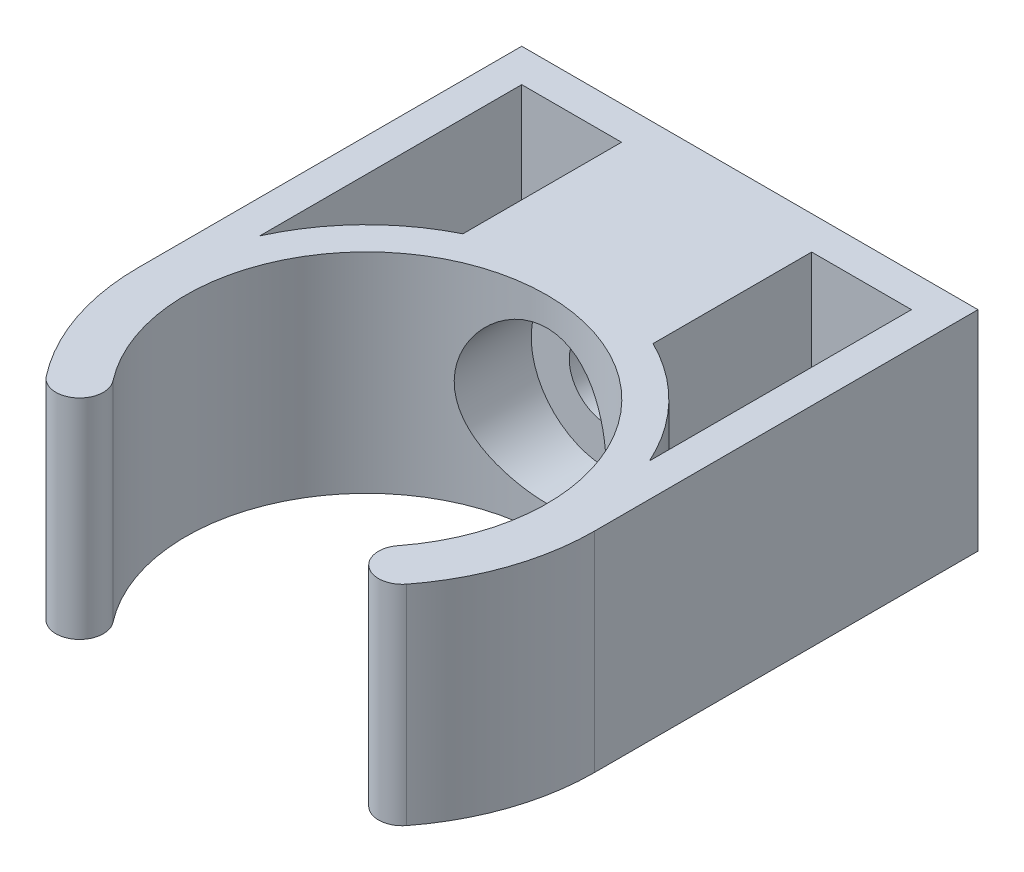
ISO-10303-21;
HEADER;
FILE_DESCRIPTION(('STEP AP214'),'2;1');
FILE_NAME('part.step','',(''),(''),'','','');
FILE_SCHEMA(('AUTOMOTIVE_DESIGN { 1 0 10303 214 1 1 1 1 }'));
ENDSEC;
DATA;
#1=APPLICATION_CONTEXT('core data for automotive mechanical design processes');
#2=APPLICATION_PROTOCOL_DEFINITION('international standard','automotive_design',2000,#1);
#3=PRODUCT_CONTEXT('',#1,'mechanical');
#4=PRODUCT('Part','Part','',(#3));
#5=PRODUCT_RELATED_PRODUCT_CATEGORY('part','',(#4));
#6=PRODUCT_DEFINITION_FORMATION('','',#4);
#7=PRODUCT_DEFINITION_CONTEXT('part definition',#1,'design');
#8=PRODUCT_DEFINITION('design','',#6,#7);
#9=PRODUCT_DEFINITION_SHAPE('','',#8);
#10=(LENGTH_UNIT() NAMED_UNIT(*) SI_UNIT(.MILLI.,.METRE.));
#11=(NAMED_UNIT(*) PLANE_ANGLE_UNIT() SI_UNIT($,.RADIAN.));
#12=(NAMED_UNIT(*) SI_UNIT($,.STERADIAN.) SOLID_ANGLE_UNIT());
#13=UNCERTAINTY_MEASURE_WITH_UNIT(LENGTH_MEASURE(1.E-05),#10,'distance_accuracy_value','');
#14=(GEOMETRIC_REPRESENTATION_CONTEXT(3) GLOBAL_UNCERTAINTY_ASSIGNED_CONTEXT((#13)) GLOBAL_UNIT_ASSIGNED_CONTEXT((#10,
#11,#12)) REPRESENTATION_CONTEXT('',''));
#15=CARTESIAN_POINT('',(0.,0.,0.));
#16=DIRECTION('',(0.,0.,1.));
#17=DIRECTION('',(1.,0.,0.));
#18=AXIS2_PLACEMENT_3D('',#15,#16,#17);
#19=CARTESIAN_POINT('',(-12.,11.,-11.25));
#20=DIRECTION('',(0.,0.,1.));
#21=DIRECTION('',(1.,0.,0.));
#22=AXIS2_PLACEMENT_3D('',#19,#20,#21);
#23=PLANE('',#22);
#24=DIRECTION('',(-1.,0.,0.));
#25=VECTOR('',#24,1.);
#26=CARTESIAN_POINT('',(-12.,1.75,-11.25));
#27=LINE('',#26,#25);
#28=CARTESIAN_POINT('',(-5.,1.75,-11.25));
#29=VERTEX_POINT('',#28);
#30=CARTESIAN_POINT('',(-10.25,1.75,-11.25));
#31=VERTEX_POINT('',#30);
#32=EDGE_CURVE('E317',#29,#31,#27,.T.);
#33=ORIENTED_EDGE('',*,*,#32,.F.);
#34=DIRECTION('',(0.,1.,0.));
#35=VECTOR('',#34,1.);
#36=CARTESIAN_POINT('',(-5.,11.,-11.25));
#37=LINE('',#36,#35);
#38=CARTESIAN_POINT('',(-5.,11.,-11.25));
#39=VERTEX_POINT('',#38);
#40=EDGE_CURVE('E95',#29,#39,#37,.T.);
#41=ORIENTED_EDGE('',*,*,#40,.T.);
#42=DIRECTION('',(-1.,0.,0.));
#43=VECTOR('',#42,1.);
#44=CARTESIAN_POINT('',(-12.,11.,-11.25));
#45=LINE('',#44,#43);
#46=CARTESIAN_POINT('',(-10.25,11.,-11.25));
#47=VERTEX_POINT('',#46);
#48=EDGE_CURVE('E102',#39,#47,#45,.T.);
#49=ORIENTED_EDGE('',*,*,#48,.T.);
#50=DIRECTION('',(0.,-1.,0.));
#51=VECTOR('',#50,1.);
#52=CARTESIAN_POINT('',(-10.25,11.,-11.25));
#53=LINE('',#52,#51);
#54=EDGE_CURVE('E213',#47,#31,#53,.T.);
#55=ORIENTED_EDGE('',*,*,#54,.T.);
#56=EDGE_LOOP('',(#33,#41,#49,#55));
#57=FACE_BOUND('',#56,.T.);
#58=ADVANCED_FACE('F73',(#57),#23,.T.);
#59=CARTESIAN_POINT('',(0.,11.,7.1690481051547));
#60=DIRECTION('',(0.,-1.,0.));
#61=DIRECTION('',(0.,0.,-1.));
#62=AXIS2_PLACEMENT_3D('',#59,#60,#61);
#63=CYLINDRICAL_SURFACE('',#62,11.25);
#64=CARTESIAN_POINT('',(0.,11.,7.1690481051547));
#65=DIRECTION('',(0.,1.,0.));
#66=DIRECTION('',(0.,0.,1.));
#67=AXIS2_PLACEMENT_3D('',#64,#65,#66);
#68=CIRCLE('',#67,11.25);
#69=CARTESIAN_POINT('',(-10.25,11.,2.53223885740684));
#70=VERTEX_POINT('',#69);
#71=CARTESIAN_POINT('',(-5.,11.,-2.90877408021849));
#72=VERTEX_POINT('',#71);
#73=EDGE_CURVE('E205',#70,#72,#68,.F.);
#74=ORIENTED_EDGE('',*,*,#73,.T.);
#75=DIRECTION('',(0.,-1.,0.));
#76=VECTOR('',#75,1.);
#77=CARTESIAN_POINT('',(-5.,11.,-2.90877408021849));
#78=LINE('',#77,#76);
#79=CARTESIAN_POINT('',(-5.,1.75,-2.90877408021849));
#80=VERTEX_POINT('',#79);
#81=EDGE_CURVE('E191',#72,#80,#78,.T.);
#82=ORIENTED_EDGE('',*,*,#81,.T.);
#83=CARTESIAN_POINT('',(0.,1.75,7.1690481051547));
#84=DIRECTION('',(0.,1.,0.));
#85=DIRECTION('',(0.,0.,1.));
#86=AXIS2_PLACEMENT_3D('',#83,#84,#85);
#87=CIRCLE('',#86,11.25);
#88=CARTESIAN_POINT('',(-10.25,1.75,2.53223885740684));
#89=VERTEX_POINT('',#88);
#90=EDGE_CURVE('E319',#89,#80,#87,.F.);
#91=ORIENTED_EDGE('',*,*,#90,.F.);
#92=DIRECTION('',(0.,-1.,0.));
#93=VECTOR('',#92,1.);
#94=CARTESIAN_POINT('',(-10.25,11.,2.53223885740684));
#95=LINE('',#94,#93);
#96=EDGE_CURVE('E210',#70,#89,#95,.T.);
#97=ORIENTED_EDGE('',*,*,#96,.F.);
#98=EDGE_LOOP('',(#74,#82,#91,#97));
#99=FACE_BOUND('',#98,.T.);
#100=ADVANCED_FACE('F209',(#99),#63,.T.);
#101=CARTESIAN_POINT('',(0.,1.75,7.1690481051547));
#102=DIRECTION('',(0.,1.,0.));
#103=DIRECTION('',(0.,0.,1.));
#104=AXIS2_PLACEMENT_3D('',#101,#102,#103);
#105=PLANE('',#104);
#106=ORIENTED_EDGE('',*,*,#90,.T.);
#107=DIRECTION('',(0.,0.,-1.));
#108=VECTOR('',#107,1.);
#109=CARTESIAN_POINT('',(-5.,1.75,7.1690481051547));
#110=LINE('',#109,#108);
#111=EDGE_CURVE('E88',#80,#29,#110,.T.);
#112=ORIENTED_EDGE('',*,*,#111,.T.);
#113=ORIENTED_EDGE('',*,*,#32,.T.);
#114=DIRECTION('',(0.,0.,1.));
#115=VECTOR('',#114,1.);
#116=CARTESIAN_POINT('',(-10.25,1.75,7.1690481051547));
#117=LINE('',#116,#115);
#118=EDGE_CURVE('E327',#31,#89,#117,.T.);
#119=ORIENTED_EDGE('',*,*,#118,.T.);
#120=EDGE_LOOP('',(#106,#112,#113,#119));
#121=FACE_BOUND('',#120,.T.);
#122=ADVANCED_FACE('F315',(#121),#105,.T.);
#123=CARTESIAN_POINT('',(12.,11.,7.1690481051547));
#124=DIRECTION('',(-1.,0.,0.));
#125=DIRECTION('',(0.,0.,1.));
#126=AXIS2_PLACEMENT_3D('',#123,#124,#125);
#127=PLANE('',#126);
#128=DIRECTION('',(0.,0.,-1.));
#129=VECTOR('',#128,1.);
#130=CARTESIAN_POINT('',(12.,0.,7.1690481051547));
#131=LINE('',#130,#129);
#132=CARTESIAN_POINT('',(12.,0.,7.1690481051547));
#133=VERTEX_POINT('',#132);
#134=CARTESIAN_POINT('',(12.,0.,-13.));
#135=VERTEX_POINT('',#134);
#136=EDGE_CURVE('E230',#133,#135,#131,.T.);
#137=ORIENTED_EDGE('',*,*,#136,.T.);
#138=DIRECTION('',(0.,-1.,0.));
#139=VECTOR('',#138,1.);
#140=CARTESIAN_POINT('',(12.,11.,-13.));
#141=LINE('',#140,#139);
#142=CARTESIAN_POINT('',(12.,11.,-13.));
#143=VERTEX_POINT('',#142);
#144=EDGE_CURVE('E308',#143,#135,#141,.T.);
#145=ORIENTED_EDGE('',*,*,#144,.F.);
#146=DIRECTION('',(0.,0.,-1.));
#147=VECTOR('',#146,1.);
#148=CARTESIAN_POINT('',(12.,11.,7.1690481051547));
#149=LINE('',#148,#147);
#150=CARTESIAN_POINT('',(12.,11.,7.1690481051547));
#151=VERTEX_POINT('',#150);
#152=EDGE_CURVE('E231',#151,#143,#149,.T.);
#153=ORIENTED_EDGE('',*,*,#152,.F.);
#154=DIRECTION('',(0.,-1.,0.));
#155=VECTOR('',#154,1.);
#156=CARTESIAN_POINT('',(12.,11.,7.1690481051547));
#157=LINE('',#156,#155);
#158=EDGE_CURVE('E257',#151,#133,#157,.T.);
#159=ORIENTED_EDGE('',*,*,#158,.T.);
#160=EDGE_LOOP('',(#137,#145,#153,#159));
#161=FACE_BOUND('',#160,.T.);
#162=ADVANCED_FACE('F75',(#161),#127,.F.);
#163=CARTESIAN_POINT('',(-12.,11.,-13.));
#164=DIRECTION('',(0.,0.,1.));
#165=DIRECTION('',(1.,0.,0.));
#166=AXIS2_PLACEMENT_3D('',#163,#164,#165);
#167=PLANE('',#166);
#168=CARTESIAN_POINT('',(0.,5.49999999999999,-13.));
#169=DIRECTION('',(0.,0.,1.));
#170=DIRECTION('',(1.,0.,0.));
#171=AXIS2_PLACEMENT_3D('',#168,#169,#170);
#172=CIRCLE('',#171,2.);
#173=CARTESIAN_POINT('',(2.,5.49999999999999,-13.));
#174=VERTEX_POINT('',#173);
#175=EDGE_CURVE('E374',#174,#174,#172,.T.);
#176=ORIENTED_EDGE('',*,*,#175,.T.);
#177=EDGE_LOOP('',(#176));
#178=FACE_BOUND('',#177,.T.);
#179=DIRECTION('',(0.,-1.,0.));
#180=VECTOR('',#179,1.);
#181=CARTESIAN_POINT('',(-12.,11.,-13.));
#182=LINE('',#181,#180);
#183=CARTESIAN_POINT('',(-12.,11.,-13.));
#184=VERTEX_POINT('',#183);
#185=CARTESIAN_POINT('',(-12.,0.,-13.));
#186=VERTEX_POINT('',#185);
#187=EDGE_CURVE('E304',#184,#186,#182,.T.);
#188=ORIENTED_EDGE('',*,*,#187,.F.);
#189=DIRECTION('',(-1.,0.,0.));
#190=VECTOR('',#189,1.);
#191=CARTESIAN_POINT('',(-12.,11.,-13.));
#192=LINE('',#191,#190);
#193=EDGE_CURVE('E235',#143,#184,#192,.T.);
#194=ORIENTED_EDGE('',*,*,#193,.F.);
#195=ORIENTED_EDGE('',*,*,#144,.T.);
#196=DIRECTION('',(-1.,0.,0.));
#197=VECTOR('',#196,1.);
#198=CARTESIAN_POINT('',(-12.,0.,-13.));
#199=LINE('',#198,#197);
#200=EDGE_CURVE('E261',#135,#186,#199,.T.);
#201=ORIENTED_EDGE('',*,*,#200,.T.);
#202=EDGE_LOOP('',(#188,#194,#195,#201));
#203=FACE_BOUND('',#202,.T.);
#204=ADVANCED_FACE('F444',(#178,#203),#167,.F.);
#205=CARTESIAN_POINT('',(-12.,11.,7.1690481051547));
#206=DIRECTION('',(1.,0.,0.));
#207=DIRECTION('',(0.,0.,-1.));
#208=AXIS2_PLACEMENT_3D('',#205,#206,#207);
#209=PLANE('',#208);
#210=DIRECTION('',(0.,0.,1.));
#211=VECTOR('',#210,1.);
#212=CARTESIAN_POINT('',(-12.,0.,7.1690481051547));
#213=LINE('',#212,#211);
#214=CARTESIAN_POINT('',(-12.,0.,7.1690481051547));
#215=VERTEX_POINT('',#214);
#216=EDGE_CURVE('E264',#186,#215,#213,.T.);
#217=ORIENTED_EDGE('',*,*,#216,.T.);
#218=DIRECTION('',(0.,-1.,0.));
#219=VECTOR('',#218,1.);
#220=CARTESIAN_POINT('',(-12.,11.,7.1690481051547));
#221=LINE('',#220,#219);
#222=CARTESIAN_POINT('',(-12.,11.,7.1690481051547));
#223=VERTEX_POINT('',#222);
#224=EDGE_CURVE('E300',#223,#215,#221,.T.);
#225=ORIENTED_EDGE('',*,*,#224,.F.);
#226=DIRECTION('',(0.,0.,1.));
#227=VECTOR('',#226,1.);
#228=CARTESIAN_POINT('',(-12.,11.,7.1690481051547));
#229=LINE('',#228,#227);
#230=EDGE_CURVE('E239',#184,#223,#229,.T.);
#231=ORIENTED_EDGE('',*,*,#230,.F.);
#232=ORIENTED_EDGE('',*,*,#187,.T.);
#233=EDGE_LOOP('',(#217,#225,#231,#232));
#234=FACE_BOUND('',#233,.T.);
#235=ADVANCED_FACE('F441',(#234),#209,.F.);
#236=CARTESIAN_POINT('',(0.,11.,7.1690481051547));
#237=DIRECTION('',(0.,-1.,0.));
#238=DIRECTION('',(0.,0.,-1.));
#239=AXIS2_PLACEMENT_3D('',#236,#237,#238);
#240=CYLINDRICAL_SURFACE('',#239,12.);
#241=CARTESIAN_POINT('',(0.,0.,7.1690481051547));
#242=DIRECTION('',(0.,1.,0.));
#243=DIRECTION('',(0.,0.,1.));
#244=AXIS2_PLACEMENT_3D('',#241,#242,#243);
#245=CIRCLE('',#244,12.);
#246=CARTESIAN_POINT('',(-9.47368421052632,0.,14.5344610249593));
#247=VERTEX_POINT('',#246);
#248=EDGE_CURVE('E267',#215,#247,#245,.T.);
#249=ORIENTED_EDGE('',*,*,#248,.T.);
#250=DIRECTION('',(0.,-1.,0.));
#251=VECTOR('',#250,1.);
#252=CARTESIAN_POINT('',(-9.47368421052632,11.,14.5344610249593));
#253=LINE('',#252,#251);
#254=CARTESIAN_POINT('',(-9.47368421052632,11.,14.5344610249593));
#255=VERTEX_POINT('',#254);
#256=EDGE_CURVE('E296',#255,#247,#253,.T.);
#257=ORIENTED_EDGE('',*,*,#256,.F.);
#258=CARTESIAN_POINT('',(0.,11.,7.1690481051547));
#259=DIRECTION('',(0.,1.,0.));
#260=DIRECTION('',(0.,0.,1.));
#261=AXIS2_PLACEMENT_3D('',#258,#259,#260);
#262=CIRCLE('',#261,12.);
#263=EDGE_CURVE('E242',#223,#255,#262,.T.);
#264=ORIENTED_EDGE('',*,*,#263,.F.);
#265=ORIENTED_EDGE('',*,*,#224,.T.);
#266=EDGE_LOOP('',(#249,#257,#264,#265));
#267=FACE_BOUND('',#266,.T.);
#268=ADVANCED_FACE('F437',(#267),#240,.T.);
#269=CARTESIAN_POINT('',(-8.48684210526316,11.,13.7672305124796));
#270=DIRECTION('',(0.,-1.,0.));
#271=DIRECTION('',(0.,0.,-1.));
#272=AXIS2_PLACEMENT_3D('',#269,#270,#271);
#273=CYLINDRICAL_SURFACE('',#272,1.25);
#274=CARTESIAN_POINT('',(-8.48684210526316,0.,13.7672305124796));
#275=DIRECTION('',(0.,1.,0.));
#276=DIRECTION('',(0.,0.,-1.));
#277=AXIS2_PLACEMENT_3D('',#274,#275,#276);
#278=CIRCLE('',#277,1.25);
#279=CARTESIAN_POINT('',(-7.5,0.,13.));
#280=VERTEX_POINT('',#279);
#281=EDGE_CURVE('E270',#247,#280,#278,.T.);
#282=ORIENTED_EDGE('',*,*,#281,.T.);
#283=DIRECTION('',(0.,-1.,0.));
#284=VECTOR('',#283,1.);
#285=CARTESIAN_POINT('',(-7.5,11.,13.));
#286=LINE('',#285,#284);
#287=CARTESIAN_POINT('',(-7.5,11.,13.));
#288=VERTEX_POINT('',#287);
#289=EDGE_CURVE('E292',#288,#280,#286,.T.);
#290=ORIENTED_EDGE('',*,*,#289,.F.);
#291=CARTESIAN_POINT('',(-8.48684210526316,11.,13.7672305124796));
#292=DIRECTION('',(0.,1.,0.));
#293=DIRECTION('',(0.,0.,-1.));
#294=AXIS2_PLACEMENT_3D('',#291,#292,#293);
#295=CIRCLE('',#294,1.25);
#296=EDGE_CURVE('E245',#255,#288,#295,.T.);
#297=ORIENTED_EDGE('',*,*,#296,.F.);
#298=ORIENTED_EDGE('',*,*,#256,.T.);
#299=EDGE_LOOP('',(#282,#290,#297,#298));
#300=FACE_BOUND('',#299,.T.);
#301=ADVANCED_FACE('F433',(#300),#273,.T.);
#302=CARTESIAN_POINT('',(0.,11.,7.1690481051547));
#303=DIRECTION('',(0.,-1.,0.));
#304=DIRECTION('',(0.,0.,-1.));
#305=AXIS2_PLACEMENT_3D('',#302,#303,#304);
#306=CYLINDRICAL_SURFACE('',#305,9.5);
#307=CARTESIAN_POINT('',(4.,5.49999999999999,-1.44779586465234));
#308=CARTESIAN_POINT('',(3.99999920365227,5.3933958895119,-1.44779668776163));
#309=CARTESIAN_POINT('',(3.9957319358542,5.286754948111,-1.44978113102662));
#310=CARTESIAN_POINT('',(3.97870775218114,5.07425234767577,-1.45765285238261));
#311=CARTESIAN_POINT('',(3.96594536927521,4.96839123488565,-1.46354264375078));
#312=CARTESIAN_POINT('',(3.93203356564338,4.75805909420673,-1.47904194126257));
#313=CARTESIAN_POINT('',(3.91086652305504,4.65359146674128,-1.48865926181559));
#314=CARTESIAN_POINT('',(3.86037998689401,4.44700660151013,-1.5112873147008));
#315=CARTESIAN_POINT('',(3.8310570585935,4.34489037366221,-1.52429947657559));
#316=CARTESIAN_POINT('',(3.7315599849548,4.04402847681403,-1.56769811491853));
#317=CARTESIAN_POINT('',(3.64967476491844,3.84965608494502,-1.60253573237505));
#318=CARTESIAN_POINT('',(3.45741232788934,3.4775639036493,-1.68007499954559));
#319=CARTESIAN_POINT('',(3.34704143098506,3.29984043224959,-1.7227749042604));
#320=CARTESIAN_POINT('',(3.09340545265793,2.95455275976187,-1.81427077016731));
#321=CARTESIAN_POINT('',(2.9486106688809,2.78816517116337,-1.8632762649652));
#322=CARTESIAN_POINT('',(2.63345602204264,2.48116894420087,-1.96013989139042));
#323=CARTESIAN_POINT('',(2.46308622671577,2.34057036855448,-2.00799756884193));
#324=CARTESIAN_POINT('',(2.09231676497945,2.0830783193601,-2.09972871094132));
#325=CARTESIAN_POINT('',(1.89091878265369,1.96751658857193,-2.14333046176482));
#326=CARTESIAN_POINT('',(1.46937305753489,1.77242564263144,-2.21906633878402));
#327=CARTESIAN_POINT('',(1.24923385879032,1.69288011123605,-2.25120565634612));
#328=CARTESIAN_POINT('',(0.808831057041752,1.57636813025214,-2.29890912221996));
#329=CARTESIAN_POINT('',(0.589192572355974,1.5373682087497,-2.31526156153196));
#330=CARTESIAN_POINT('',(0.1459212961379,1.49647791119912,-2.33241605129786));
#331=CARTESIAN_POINT('',(-0.0777098003891344,1.49457214548392,-2.33322455063818));
#332=CARTESIAN_POINT('',(-0.507809014322284,1.52687201870988,-2.31965993090522));
#333=CARTESIAN_POINT('',(-0.714480298467531,1.55884167427961,-2.30622681485801));
#334=CARTESIAN_POINT('',(-1.11920616443699,1.65414388128752,-2.26698560121803));
#335=CARTESIAN_POINT('',(-1.31726010922457,1.71747874712743,-2.24117659042709));
#336=CARTESIAN_POINT('',(-1.70277425779944,1.87445787547147,-2.17917602459217));
#337=CARTESIAN_POINT('',(-1.89002630779712,1.96855054659769,-2.14283182700316));
#338=CARTESIAN_POINT('',(-2.24657465770714,2.18392928340789,-2.06330374752318));
#339=CARTESIAN_POINT('',(-2.4158645382903,2.30522502303991,-2.02011743404863));
#340=CARTESIAN_POINT('',(-2.74459541942161,2.58168462483473,-1.92756755461871));
#341=CARTESIAN_POINT('',(-2.90245769431404,2.73865435362879,-1.87798309697411));
#342=CARTESIAN_POINT('',(-3.19030905144212,3.07692731834381,-1.78053685914856));
#343=CARTESIAN_POINT('',(-3.32028691843322,3.2582402977487,-1.73267577853453));
#344=CARTESIAN_POINT('',(-3.55285473738947,3.64786429218683,-1.64249829935388));
#345=CARTESIAN_POINT('',(-3.65435735480679,3.85688602183361,-1.60042717871981));
#346=CARTESIAN_POINT('',(-3.82007496880754,4.29129673851623,-1.52952920110707));
#347=CARTESIAN_POINT('',(-3.88431728369775,4.51667359763221,-1.50069264412833));
#348=CARTESIAN_POINT('',(-3.9696294380598,4.96156479271675,-1.46194894058512));
#349=CARTESIAN_POINT('',(-3.993263518851,5.18048795833547,-1.45092037645054));
#350=CARTESIAN_POINT('',(-4.0042333597211,5.61940280460085,-1.44583309805891));
#351=CARTESIAN_POINT('',(-3.99158212674787,5.83939407414844,-1.45176830291314));
#352=CARTESIAN_POINT('',(-3.93268182382048,6.25889632288022,-1.47877922044339));
#353=CARTESIAN_POINT('',(-3.88870483169292,6.4588008376862,-1.49883002627384));
#354=CARTESIAN_POINT('',(-3.77142924464059,6.84822017288409,-1.55049294983319));
#355=CARTESIAN_POINT('',(-3.69812369903528,7.03773251828345,-1.58210780801651));
#356=CARTESIAN_POINT('',(-3.52079864778837,7.41005459670814,-1.65498226167816));
#357=CARTESIAN_POINT('',(-3.41559931118618,7.5922307166274,-1.69659661291717));
#358=CARTESIAN_POINT('',(-3.17863832384833,7.93723172882047,-1.78428666486128));
#359=CARTESIAN_POINT('',(-3.04686500598842,8.10004807123129,-1.83036432051574));
#360=CARTESIAN_POINT('',(-2.74753739971471,8.41585632496568,-1.92642968833363));
#361=CARTESIAN_POINT('',(-2.57791458120941,8.56689384007014,-1.97642274182477));
#362=CARTESIAN_POINT('',(-2.21458437739196,8.83872507856779,-2.07112636498597));
#363=CARTESIAN_POINT('',(-2.02087499989838,8.95951629781886,-2.11583649711229));
#364=CARTESIAN_POINT('',(-1.61330019295804,9.16738843272665,-2.19527024540287));
#365=CARTESIAN_POINT('',(-1.39936863834622,9.2543536414871,-2.22995948129974));
#366=CARTESIAN_POINT('',(-0.958072669830152,9.3904138875023,-2.28512628499646));
#367=CARTESIAN_POINT('',(-0.730716529714416,9.43953199358915,-2.30561250915129));
#368=CARTESIAN_POINT('',(-0.286474708646801,9.4955540562212,-2.32905027528816));
#369=CARTESIAN_POINT('',(-0.0699943441316044,9.50521183421123,-2.33314526060042));
#370=CARTESIAN_POINT('',(0.361433502234724,9.48947785490982,-2.32652321940366));
#371=CARTESIAN_POINT('',(0.576381255820821,9.46409247441026,-2.31580888774068));
#372=CARTESIAN_POINT('',(0.990478887183237,9.38097024400413,-2.28137954997006));
#373=CARTESIAN_POINT('',(1.18991903602096,9.32445818286624,-2.25815742881245));
#374=CARTESIAN_POINT('',(1.57640122736064,9.18203715179273,-2.20128535449516));
#375=CARTESIAN_POINT('',(1.76344093296738,9.09612265958554,-2.16763344255731));
#376=CARTESIAN_POINT('',(2.12916899229197,8.89298853587,-2.09125016971069));
#377=CARTESIAN_POINT('',(2.30709321191543,8.77452523197967,-2.04817609128411));
#378=CARTESIAN_POINT('',(2.6413041686998,8.51144035672069,-1.95802826848612));
#379=CARTESIAN_POINT('',(2.79758263107987,8.3668088301755,-1.91095300557052));
#380=CARTESIAN_POINT('',(3.0953928108494,8.04364979626055,-1.81397802863026));
#381=CARTESIAN_POINT('',(3.23513635037118,7.86346195303566,-1.76411026033014));
#382=CARTESIAN_POINT('',(3.48272431999051,7.4805394177849,-1.67053524548239));
#383=CARTESIAN_POINT('',(3.59055067575903,7.2777920396244,-1.62683149685231));
#384=CARTESIAN_POINT('',(3.72528384389563,6.96130104392928,-1.57020838636432));
#385=CARTESIAN_POINT('',(3.76565500657312,6.85390602657862,-1.55284139714298));
#386=CARTESIAN_POINT('',(3.8371324591037,6.63559648905498,-1.52163321794956));
#387=CARTESIAN_POINT('',(3.86824330676977,6.52468373011598,-1.50779029396318));
#388=CARTESIAN_POINT('',(3.92077213220802,6.30048435539643,-1.48418096514645));
#389=CARTESIAN_POINT('',(3.94221567817546,6.18720484049488,-1.47440381249989));
#390=CARTESIAN_POINT('',(3.97524931223112,5.9589836911775,-1.45926155864439));
#391=CARTESIAN_POINT('',(3.98684702220686,5.84404341263163,-1.4538930447125));
#392=CARTESIAN_POINT('',(3.9956332562663,5.69071734970767,-1.44982173201371));
#393=CARTESIAN_POINT('',(3.99727028618603,5.65259801895598,-1.44906256713486));
#394=CARTESIAN_POINT('',(3.99945380687364,5.5763206990999,-1.44804948321396));
#395=CARTESIAN_POINT('',(4.00000028508082,5.53816270955531,-1.44779556999128));
#396=CARTESIAN_POINT('',(4.,5.49999999999999,-1.44779586465234));
#397=B_SPLINE_CURVE_WITH_KNOTS('',3,(#307,#308,#309,#310,#311,#312,#313,#314,#315,#316,#317,
#318,#319,#320,#321,#322,#323,#324,#325,#326,#327,#328,#329,#330,#331,#332,#333,#334,#335,#336,
#337,#338,#339,#340,#341,#342,#343,#344,#345,#346,#347,#348,#349,#350,#351,#352,#353,#354,#355,
#356,#357,#358,#359,#360,#361,#362,#363,#364,#365,#366,#367,#368,#369,#370,#371,#372,#373,#374,
#375,#376,#377,#378,#379,#380,#381,#382,#383,#384,#385,#386,#387,#388,#389,#390,#391,#392,#393,
#394,#395,#396),.UNSPECIFIED.,.T.,.F.,(4,2,2,2,2,2,2,2,2,2,2,2,2,2,2,2,2,2,2,2,2,2,2,2,2,2,2,2,
2,2,2,2,2,2,2,2,2,2,2,2,2,2,2,2,4),(0.,0.319772366886332,0.639750722482064,0.960403542474575,
1.28119160554606,1.91941485949962,2.5574966330489,3.2323692873258,3.90750471525451,
4.61265468584009,5.31748488536106,5.98495446117314,6.65214711051577,7.27789194731659,
7.903682963969,8.53903757514859,9.17461849025399,9.85581264141673,10.5372802606464,
11.2420285324283,11.9462594453847,12.6041187250203,13.2617422158223,13.8759716592521,
14.4903467574614,15.1310059864599,15.771947107277,16.4663870686194,17.1608845048288,
17.857737108415,18.5541646247675,19.2010623509438,19.8478423768722,20.4708232264834,
21.0939211466585,21.7452945265382,22.3969162314221,23.0939758531618,23.7914294597657,
24.1391554393292,24.4867099883701,24.8333398493605,25.1797011309018,25.2941736343779,
25.4086474563105),.UNSPECIFIED.);
#398=CARTESIAN_POINT('',(4.,5.49999999999999,-1.44779586465234));
#399=VERTEX_POINT('',#398);
#400=EDGE_CURVE('E77',#399,#399,#397,.T.);
#401=ORIENTED_EDGE('',*,*,#400,.T.);
#402=EDGE_LOOP('',(#401));
#403=FACE_BOUND('',#402,.T.);
#404=DIRECTION('',(0.,-1.,0.));
#405=VECTOR('',#404,1.);
#406=CARTESIAN_POINT('',(7.5,11.,13.));
#407=LINE('',#406,#405);
#408=CARTESIAN_POINT('',(7.5,11.,13.));
#409=VERTEX_POINT('',#408);
#410=CARTESIAN_POINT('',(7.5,0.,13.));
#411=VERTEX_POINT('',#410);
#412=EDGE_CURVE('E288',#409,#411,#407,.T.);
#413=ORIENTED_EDGE('',*,*,#412,.F.);
#414=CARTESIAN_POINT('',(0.,11.,7.1690481051547));
#415=DIRECTION('',(0.,-1.,0.));
#416=DIRECTION('',(0.,0.,1.));
#417=AXIS2_PLACEMENT_3D('',#414,#415,#416);
#418=CIRCLE('',#417,9.5);
#419=EDGE_CURVE('E248',#288,#409,#418,.T.);
#420=ORIENTED_EDGE('',*,*,#419,.F.);
#421=ORIENTED_EDGE('',*,*,#289,.T.);
#422=CARTESIAN_POINT('',(0.,0.,7.1690481051547));
#423=DIRECTION('',(0.,-1.,0.));
#424=DIRECTION('',(0.,0.,1.));
#425=AXIS2_PLACEMENT_3D('',#422,#423,#424);
#426=CIRCLE('',#425,9.5);
#427=EDGE_CURVE('E273',#280,#411,#426,.T.);
#428=ORIENTED_EDGE('',*,*,#427,.T.);
#429=EDGE_LOOP('',(#413,#420,#421,#428));
#430=FACE_BOUND('',#429,.T.);
#431=ADVANCED_FACE('F428',(#403,#430),#306,.F.);
#432=CARTESIAN_POINT('',(8.48684210526316,11.,13.7672305124796));
#433=DIRECTION('',(0.,-1.,0.));
#434=DIRECTION('',(0.,0.,-1.));
#435=AXIS2_PLACEMENT_3D('',#432,#433,#434);
#436=CYLINDRICAL_SURFACE('',#435,1.25);
#437=CARTESIAN_POINT('',(8.48684210526316,0.,13.7672305124796));
#438=DIRECTION('',(0.,1.,0.));
#439=DIRECTION('',(0.,0.,1.));
#440=AXIS2_PLACEMENT_3D('',#437,#438,#439);
#441=CIRCLE('',#440,1.25);
#442=CARTESIAN_POINT('',(9.47368421052631,0.,14.5344610249593));
#443=VERTEX_POINT('',#442);
#444=EDGE_CURVE('E276',#411,#443,#441,.T.);
#445=ORIENTED_EDGE('',*,*,#444,.T.);
#446=DIRECTION('',(0.,-1.,0.));
#447=VECTOR('',#446,1.);
#448=CARTESIAN_POINT('',(9.47368421052631,11.,14.5344610249593));
#449=LINE('',#448,#447);
#450=CARTESIAN_POINT('',(9.47368421052631,11.,14.5344610249593));
#451=VERTEX_POINT('',#450);
#452=EDGE_CURVE('E284',#451,#443,#449,.T.);
#453=ORIENTED_EDGE('',*,*,#452,.F.);
#454=CARTESIAN_POINT('',(8.48684210526316,11.,13.7672305124796));
#455=DIRECTION('',(0.,1.,0.));
#456=DIRECTION('',(0.,0.,1.));
#457=AXIS2_PLACEMENT_3D('',#454,#455,#456);
#458=CIRCLE('',#457,1.25);
#459=EDGE_CURVE('E251',#409,#451,#458,.T.);
#460=ORIENTED_EDGE('',*,*,#459,.F.);
#461=ORIENTED_EDGE('',*,*,#412,.T.);
#462=EDGE_LOOP('',(#445,#453,#460,#461));
#463=FACE_BOUND('',#462,.T.);
#464=ADVANCED_FACE('F425',(#463),#436,.T.);
#465=CARTESIAN_POINT('',(0.,11.,7.1690481051547));
#466=DIRECTION('',(0.,-1.,0.));
#467=DIRECTION('',(0.,0.,-1.));
#468=AXIS2_PLACEMENT_3D('',#465,#466,#467);
#469=CYLINDRICAL_SURFACE('',#468,12.);
#470=CARTESIAN_POINT('',(0.,0.,7.1690481051547));
#471=DIRECTION('',(0.,1.,0.));
#472=DIRECTION('',(0.,0.,1.));
#473=AXIS2_PLACEMENT_3D('',#470,#471,#472);
#474=CIRCLE('',#473,12.);
#475=EDGE_CURVE('E236',#443,#133,#474,.T.);
#476=ORIENTED_EDGE('',*,*,#475,.T.);
#477=ORIENTED_EDGE('',*,*,#158,.F.);
#478=CARTESIAN_POINT('',(0.,11.,7.1690481051547));
#479=DIRECTION('',(0.,1.,0.));
#480=DIRECTION('',(0.,0.,1.));
#481=AXIS2_PLACEMENT_3D('',#478,#479,#480);
#482=CIRCLE('',#481,12.);
#483=EDGE_CURVE('E254',#451,#151,#482,.T.);
#484=ORIENTED_EDGE('',*,*,#483,.F.);
#485=ORIENTED_EDGE('',*,*,#452,.T.);
#486=EDGE_LOOP('',(#476,#477,#484,#485));
#487=FACE_BOUND('',#486,.T.);
#488=ADVANCED_FACE('F420',(#487),#469,.T.);
#489=CARTESIAN_POINT('',(0.,11.,7.1690481051547));
#490=DIRECTION('',(0.,1.,0.));
#491=DIRECTION('',(0.,0.,1.));
#492=AXIS2_PLACEMENT_3D('',#489,#490,#491);
#493=PLANE('',#492);
#494=CARTESIAN_POINT('',(5.,11.,-2.90877408021849));
#495=VERTEX_POINT('',#494);
#496=CARTESIAN_POINT('',(10.25,11.,2.53223885740685));
#497=VERTEX_POINT('',#496);
#498=EDGE_CURVE('E214',#495,#497,#68,.F.);
#499=ORIENTED_EDGE('',*,*,#498,.F.);
#500=DIRECTION('',(0.,0.,-1.));
#501=VECTOR('',#500,1.);
#502=CARTESIAN_POINT('',(5.,11.,0.));
#503=LINE('',#502,#501);
#504=CARTESIAN_POINT('',(5.,11.,-11.25));
#505=VERTEX_POINT('',#504);
#506=EDGE_CURVE('E207',#495,#505,#503,.T.);
#507=ORIENTED_EDGE('',*,*,#506,.T.);
#508=CARTESIAN_POINT('',(10.25,11.,-11.25));
#509=VERTEX_POINT('',#508);
#510=EDGE_CURVE('E340',#509,#505,#45,.T.);
#511=ORIENTED_EDGE('',*,*,#510,.F.);
#512=DIRECTION('',(0.,0.,-1.));
#513=VECTOR('',#512,1.);
#514=CARTESIAN_POINT('',(10.25,11.,7.1690481051547));
#515=LINE('',#514,#513);
#516=EDGE_CURVE('E338',#497,#509,#515,.T.);
#517=ORIENTED_EDGE('',*,*,#516,.F.);
#518=EDGE_LOOP('',(#499,#507,#511,#517));
#519=FACE_BOUND('',#518,.T.);
#520=ORIENTED_EDGE('',*,*,#193,.T.);
#521=ORIENTED_EDGE('',*,*,#230,.T.);
#522=ORIENTED_EDGE('',*,*,#263,.T.);
#523=ORIENTED_EDGE('',*,*,#296,.T.);
#524=ORIENTED_EDGE('',*,*,#419,.T.);
#525=ORIENTED_EDGE('',*,*,#459,.T.);
#526=ORIENTED_EDGE('',*,*,#483,.T.);
#527=ORIENTED_EDGE('',*,*,#152,.T.);
#528=EDGE_LOOP('',(#520,#521,#522,#523,#524,#525,#526,#527));
#529=FACE_BOUND('',#528,.T.);
#530=DIRECTION('',(0.,0.,-1.));
#531=VECTOR('',#530,1.);
#532=CARTESIAN_POINT('',(-5.,11.,0.));
#533=LINE('',#532,#531);
#534=EDGE_CURVE('E194',#72,#39,#533,.T.);
#535=ORIENTED_EDGE('',*,*,#534,.F.);
#536=ORIENTED_EDGE('',*,*,#73,.F.);
#537=DIRECTION('',(0.,0.,1.));
#538=VECTOR('',#537,1.);
#539=CARTESIAN_POINT('',(-10.25,11.,7.1690481051547));
#540=LINE('',#539,#538);
#541=EDGE_CURVE('E220',#47,#70,#540,.T.);
#542=ORIENTED_EDGE('',*,*,#541,.F.);
#543=ORIENTED_EDGE('',*,*,#48,.F.);
#544=EDGE_LOOP('',(#535,#536,#542,#543));
#545=FACE_BOUND('',#544,.T.);
#546=ADVANCED_FACE('F203',(#519,#529,#545),#493,.T.);
#547=CARTESIAN_POINT('',(0.,0.,7.1690481051547));
#548=DIRECTION('',(0.,1.,0.));
#549=DIRECTION('',(0.,0.,1.));
#550=AXIS2_PLACEMENT_3D('',#547,#548,#549);
#551=PLANE('',#550);
#552=ORIENTED_EDGE('',*,*,#136,.F.);
#553=ORIENTED_EDGE('',*,*,#475,.F.);
#554=ORIENTED_EDGE('',*,*,#444,.F.);
#555=ORIENTED_EDGE('',*,*,#427,.F.);
#556=ORIENTED_EDGE('',*,*,#281,.F.);
#557=ORIENTED_EDGE('',*,*,#248,.F.);
#558=ORIENTED_EDGE('',*,*,#216,.F.);
#559=ORIENTED_EDGE('',*,*,#200,.F.);
#560=EDGE_LOOP('',(#552,#553,#554,#555,#556,#557,#558,#559));
#561=FACE_BOUND('',#560,.T.);
#562=ADVANCED_FACE('F411',(#561),#551,.F.);
#563=CARTESIAN_POINT('',(10.25,11.,7.1690481051547));
#564=DIRECTION('',(-1.,0.,0.));
#565=DIRECTION('',(0.,0.,1.));
#566=AXIS2_PLACEMENT_3D('',#563,#564,#565);
#567=PLANE('',#566);
#568=ORIENTED_EDGE('',*,*,#516,.T.);
#569=DIRECTION('',(0.,-1.,0.));
#570=VECTOR('',#569,1.);
#571=CARTESIAN_POINT('',(10.25,11.,-11.25));
#572=LINE('',#571,#570);
#573=CARTESIAN_POINT('',(10.25,1.75,-11.25));
#574=VERTEX_POINT('',#573);
#575=EDGE_CURVE('E218',#509,#574,#572,.T.);
#576=ORIENTED_EDGE('',*,*,#575,.T.);
#577=DIRECTION('',(0.,0.,-1.));
#578=VECTOR('',#577,1.);
#579=CARTESIAN_POINT('',(10.25,1.75,7.1690481051547));
#580=LINE('',#579,#578);
#581=CARTESIAN_POINT('',(10.25,1.75,2.53223885740685));
#582=VERTEX_POINT('',#581);
#583=EDGE_CURVE('E322',#582,#574,#580,.T.);
#584=ORIENTED_EDGE('',*,*,#583,.F.);
#585=DIRECTION('',(0.,-1.,0.));
#586=VECTOR('',#585,1.);
#587=CARTESIAN_POINT('',(10.25,11.,2.53223885740685));
#588=LINE('',#587,#586);
#589=EDGE_CURVE('E224',#497,#582,#588,.T.);
#590=ORIENTED_EDGE('',*,*,#589,.F.);
#591=EDGE_LOOP('',(#568,#576,#584,#590));
#592=FACE_BOUND('',#591,.T.);
#593=ADVANCED_FACE('F363',(#592),#567,.T.);
#594=DIRECTION('',(0.,1.,0.));
#595=VECTOR('',#594,1.);
#596=CARTESIAN_POINT('',(5.,11.,-11.25));
#597=LINE('',#596,#595);
#598=CARTESIAN_POINT('',(5.,1.75,-11.25));
#599=VERTEX_POINT('',#598);
#600=EDGE_CURVE('E329',#599,#505,#597,.T.);
#601=ORIENTED_EDGE('',*,*,#600,.F.);
#602=EDGE_CURVE('E321',#574,#599,#27,.T.);
#603=ORIENTED_EDGE('',*,*,#602,.F.);
#604=ORIENTED_EDGE('',*,*,#575,.F.);
#605=ORIENTED_EDGE('',*,*,#510,.T.);
#606=EDGE_LOOP('',(#601,#603,#604,#605));
#607=FACE_BOUND('',#606,.T.);
#608=ADVANCED_FACE('F365',(#607),#23,.T.);
#609=CARTESIAN_POINT('',(-10.25,11.,7.1690481051547));
#610=DIRECTION('',(1.,0.,0.));
#611=DIRECTION('',(0.,0.,-1.));
#612=AXIS2_PLACEMENT_3D('',#609,#610,#611);
#613=PLANE('',#612);
#614=ORIENTED_EDGE('',*,*,#96,.T.);
#615=ORIENTED_EDGE('',*,*,#118,.F.);
#616=ORIENTED_EDGE('',*,*,#54,.F.);
#617=ORIENTED_EDGE('',*,*,#541,.T.);
#618=EDGE_LOOP('',(#614,#615,#616,#617));
#619=FACE_BOUND('',#618,.T.);
#620=ADVANCED_FACE('F404',(#619),#613,.T.);
#621=DIRECTION('',(0.,-1.,0.));
#622=VECTOR('',#621,1.);
#623=CARTESIAN_POINT('',(5.,11.,-2.90877408021849));
#624=LINE('',#623,#622);
#625=CARTESIAN_POINT('',(5.,1.75,-2.90877408021849));
#626=VERTEX_POINT('',#625);
#627=EDGE_CURVE('E380',#495,#626,#624,.T.);
#628=ORIENTED_EDGE('',*,*,#627,.F.);
#629=ORIENTED_EDGE('',*,*,#498,.T.);
#630=ORIENTED_EDGE('',*,*,#589,.T.);
#631=EDGE_CURVE('E335',#626,#582,#87,.F.);
#632=ORIENTED_EDGE('',*,*,#631,.F.);
#633=EDGE_LOOP('',(#628,#629,#630,#632));
#634=FACE_BOUND('',#633,.T.);
#635=ADVANCED_FACE('F358',(#634),#63,.T.);
#636=DIRECTION('',(0.,0.,-1.));
#637=VECTOR('',#636,1.);
#638=CARTESIAN_POINT('',(5.,1.75,7.1690481051547));
#639=LINE('',#638,#637);
#640=EDGE_CURVE('E12',#626,#599,#639,.T.);
#641=ORIENTED_EDGE('',*,*,#640,.F.);
#642=ORIENTED_EDGE('',*,*,#631,.T.);
#643=ORIENTED_EDGE('',*,*,#583,.T.);
#644=ORIENTED_EDGE('',*,*,#602,.T.);
#645=EDGE_LOOP('',(#641,#642,#643,#644));
#646=FACE_BOUND('',#645,.T.);
#647=ADVANCED_FACE('F353',(#646),#105,.T.);
#648=CARTESIAN_POINT('',(5.,-12.8728789049935,0.));
#649=DIRECTION('',(1.,0.,0.));
#650=DIRECTION('',(0.,0.,-1.));
#651=AXIS2_PLACEMENT_3D('',#648,#649,#650);
#652=PLANE('',#651);
#653=ORIENTED_EDGE('',*,*,#640,.T.);
#654=ORIENTED_EDGE('',*,*,#600,.T.);
#655=ORIENTED_EDGE('',*,*,#506,.F.);
#656=ORIENTED_EDGE('',*,*,#627,.T.);
#657=EDGE_LOOP('',(#653,#654,#655,#656));
#658=FACE_BOUND('',#657,.T.);
#659=ADVANCED_FACE('F384',(#658),#652,.T.);
#660=CARTESIAN_POINT('',(-5.,-12.8728789049935,0.));
#661=DIRECTION('',(1.,0.,0.));
#662=DIRECTION('',(0.,0.,-1.));
#663=AXIS2_PLACEMENT_3D('',#660,#661,#662);
#664=PLANE('',#663);
#665=ORIENTED_EDGE('',*,*,#40,.F.);
#666=ORIENTED_EDGE('',*,*,#111,.F.);
#667=ORIENTED_EDGE('',*,*,#81,.F.);
#668=ORIENTED_EDGE('',*,*,#534,.T.);
#669=EDGE_LOOP('',(#665,#666,#667,#668));
#670=FACE_BOUND('',#669,.T.);
#671=ADVANCED_FACE('F193',(#670),#664,.F.);
#672=CARTESIAN_POINT('',(0.,5.49999999999999,0.));
#673=DIRECTION('',(0.,0.,1.));
#674=DIRECTION('',(1.,0.,0.));
#675=AXIS2_PLACEMENT_3D('',#672,#673,#674);
#676=CYLINDRICAL_SURFACE('',#675,4.);
#677=CARTESIAN_POINT('',(0.,5.49999999999999,-5.5));
#678=DIRECTION('',(0.,0.,1.));
#679=DIRECTION('',(1.,0.,0.));
#680=AXIS2_PLACEMENT_3D('',#677,#678,#679);
#681=CIRCLE('',#680,4.);
#682=CARTESIAN_POINT('',(4.,5.49999999999999,-5.5));
#683=VERTEX_POINT('',#682);
#684=EDGE_CURVE('E482',#683,#683,#681,.T.);
#685=ORIENTED_EDGE('',*,*,#684,.F.);
#686=EDGE_LOOP('',(#685));
#687=FACE_BOUND('',#686,.T.);
#688=ORIENTED_EDGE('',*,*,#400,.F.);
#689=EDGE_LOOP('',(#688));
#690=FACE_BOUND('',#689,.T.);
#691=ADVANCED_FACE('F391',(#687,#690),#676,.F.);
#692=CARTESIAN_POINT('',(0.,5.49999999999999,0.));
#693=DIRECTION('',(0.,0.,1.));
#694=DIRECTION('',(1.,0.,0.));
#695=AXIS2_PLACEMENT_3D('',#692,#693,#694);
#696=CYLINDRICAL_SURFACE('',#695,2.);
#697=ORIENTED_EDGE('',*,*,#175,.F.);
#698=EDGE_LOOP('',(#697));
#699=FACE_BOUND('',#698,.T.);
#700=CARTESIAN_POINT('',(0.,5.49999999999999,-5.5));
#701=DIRECTION('',(0.,0.,1.));
#702=DIRECTION('',(1.,0.,0.));
#703=AXIS2_PLACEMENT_3D('',#700,#701,#702);
#704=CIRCLE('',#703,2.);
#705=CARTESIAN_POINT('',(2.,5.49999999999999,-5.5));
#706=VERTEX_POINT('',#705);
#707=EDGE_CURVE('E479',#706,#706,#704,.T.);
#708=ORIENTED_EDGE('',*,*,#707,.T.);
#709=EDGE_LOOP('',(#708));
#710=FACE_BOUND('',#709,.T.);
#711=ADVANCED_FACE('F494',(#699,#710),#696,.F.);
#712=CARTESIAN_POINT('',(2.,5.49999999999999,-5.5));
#713=DIRECTION('',(0.,0.,-1.));
#714=DIRECTION('',(-1.,0.,0.));
#715=AXIS2_PLACEMENT_3D('',#712,#713,#714);
#716=PLANE('',#715);
#717=ORIENTED_EDGE('',*,*,#707,.F.);
#718=EDGE_LOOP('',(#717));
#719=FACE_BOUND('',#718,.T.);
#720=ORIENTED_EDGE('',*,*,#684,.T.);
#721=EDGE_LOOP('',(#720));
#722=FACE_BOUND('',#721,.T.);
#723=ADVANCED_FACE('F490',(#719,#722),#716,.F.);
#724=CLOSED_SHELL('',(#58,#100,#122,#162,#204,#235,#268,#301,#431,#464,#488,#546,#562,#593,#608,
#620,#635,#647,#659,#671,#691,#711,#723));
#725=MANIFOLD_SOLID_BREP('B2',#724);
#726=ADVANCED_BREP_SHAPE_REPRESENTATION('',(#18,#725),#14);
#727=SHAPE_DEFINITION_REPRESENTATION(#9,#726);
ENDSEC;
END-ISO-10303-21;
